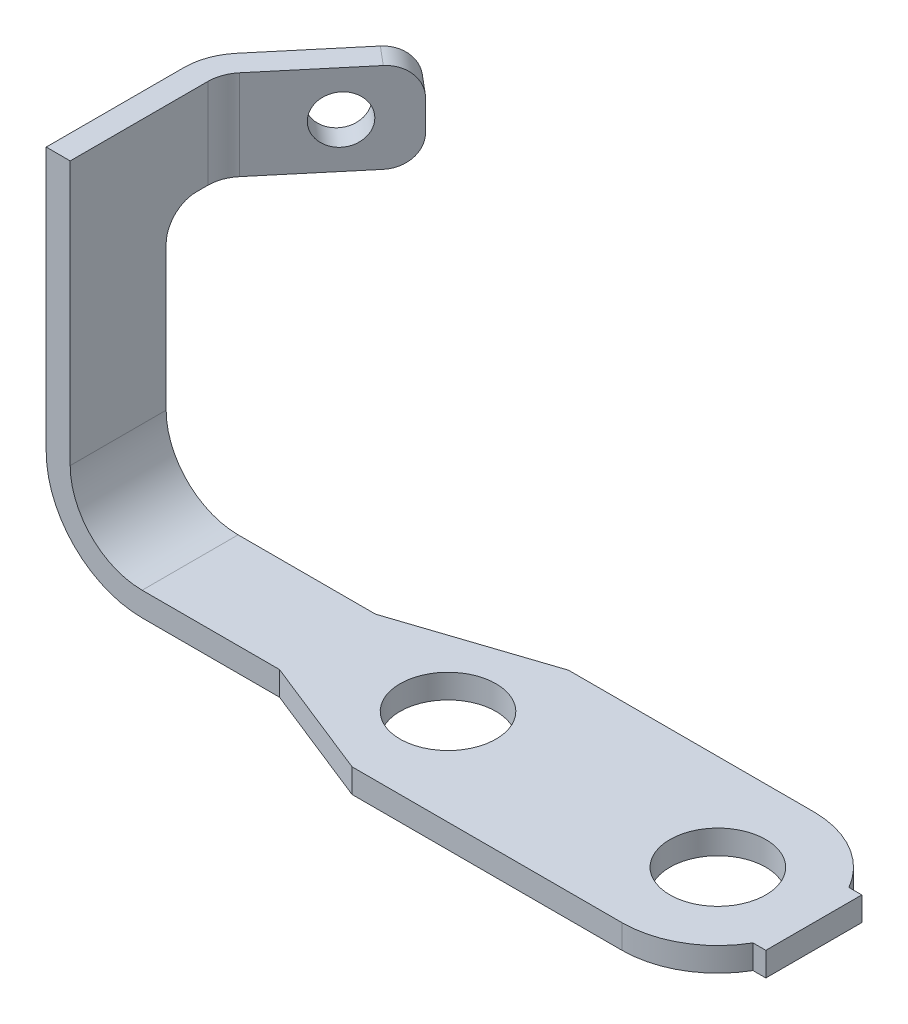
ISO-10303-21;
HEADER;
FILE_DESCRIPTION(('STEP AP214'),'2;1');
FILE_NAME('part.step','',(''),(''),'','','');
FILE_SCHEMA(('AUTOMOTIVE_DESIGN { 1 0 10303 214 1 1 1 1 }'));
ENDSEC;
DATA;
#1=APPLICATION_CONTEXT('core data for automotive mechanical design processes');
#2=APPLICATION_PROTOCOL_DEFINITION('international standard','automotive_design',2000,#1);
#3=PRODUCT_CONTEXT('',#1,'mechanical');
#4=PRODUCT('Part','Part','',(#3));
#5=PRODUCT_RELATED_PRODUCT_CATEGORY('part','',(#4));
#6=PRODUCT_DEFINITION_FORMATION('','',#4);
#7=PRODUCT_DEFINITION_CONTEXT('part definition',#1,'design');
#8=PRODUCT_DEFINITION('design','',#6,#7);
#9=PRODUCT_DEFINITION_SHAPE('','',#8);
#10=(LENGTH_UNIT() NAMED_UNIT(*) SI_UNIT(.MILLI.,.METRE.));
#11=(NAMED_UNIT(*) PLANE_ANGLE_UNIT() SI_UNIT($,.RADIAN.));
#12=(NAMED_UNIT(*) SI_UNIT($,.STERADIAN.) SOLID_ANGLE_UNIT());
#13=UNCERTAINTY_MEASURE_WITH_UNIT(LENGTH_MEASURE(1.E-05),#10,'distance_accuracy_value','');
#14=(GEOMETRIC_REPRESENTATION_CONTEXT(3) GLOBAL_UNCERTAINTY_ASSIGNED_CONTEXT((#13)) GLOBAL_UNIT_ASSIGNED_CONTEXT((#10,
#11,#12)) REPRESENTATION_CONTEXT('',''));
#15=CARTESIAN_POINT('',(0.,0.,0.));
#16=DIRECTION('',(0.,0.,1.));
#17=DIRECTION('',(1.,0.,0.));
#18=AXIS2_PLACEMENT_3D('',#15,#16,#17);
#19=CARTESIAN_POINT('',(-104.,16.,8.));
#20=DIRECTION('',(0.,0.,-1.));
#21=DIRECTION('',(-1.,0.,0.));
#22=AXIS2_PLACEMENT_3D('',#19,#20,#21);
#23=PLANE('',#22);
#24=DIRECTION('',(-1.,0.,0.));
#25=VECTOR('',#24,1.);
#26=CARTESIAN_POINT('',(0.,4.,8.));
#27=LINE('',#26,#25);
#28=CARTESIAN_POINT('',(0.,4.,8.));
#29=VERTEX_POINT('',#28);
#30=CARTESIAN_POINT('',(-2.14359353944898,4.,8.));
#31=VERTEX_POINT('',#30);
#32=EDGE_CURVE('E397',#29,#31,#27,.T.);
#33=ORIENTED_EDGE('',*,*,#32,.T.);
#34=DIRECTION('',(0.,1.,0.));
#35=VECTOR('',#34,1.);
#36=CARTESIAN_POINT('',(-2.14359353944898,0.,8.));
#37=LINE('',#36,#35);
#38=CARTESIAN_POINT('',(-2.14359353944898,0.,8.));
#39=VERTEX_POINT('',#38);
#40=EDGE_CURVE('E345',#39,#31,#37,.T.);
#41=ORIENTED_EDGE('',*,*,#40,.F.);
#42=DIRECTION('',(-1.,0.,0.));
#43=VECTOR('',#42,1.);
#44=CARTESIAN_POINT('',(0.,0.,8.));
#45=LINE('',#44,#43);
#46=CARTESIAN_POINT('',(0.,0.,8.));
#47=VERTEX_POINT('',#46);
#48=EDGE_CURVE('E388',#47,#39,#45,.T.);
#49=ORIENTED_EDGE('',*,*,#48,.F.);
#50=DIRECTION('',(0.,-1.,0.));
#51=VECTOR('',#50,1.);
#52=CARTESIAN_POINT('',(0.,4.,8.));
#53=LINE('',#52,#51);
#54=EDGE_CURVE('E392',#29,#47,#53,.T.);
#55=ORIENTED_EDGE('',*,*,#54,.F.);
#56=EDGE_LOOP('',(#33,#41,#49,#55));
#57=FACE_BOUND('',#56,.T.);
#58=ADVANCED_FACE('F41',(#57),#23,.F.);
#59=CARTESIAN_POINT('',(-104.,16.,-8.));
#60=DIRECTION('',(0.,0.,-1.));
#61=DIRECTION('',(-1.,0.,0.));
#62=AXIS2_PLACEMENT_3D('',#59,#60,#61);
#63=PLANE('',#62);
#64=DIRECTION('',(0.,1.,0.));
#65=VECTOR('',#64,1.);
#66=CARTESIAN_POINT('',(-120.,16.,-8.));
#67=LINE('',#66,#65);
#68=CARTESIAN_POINT('',(-120.,16.,-8.));
#69=VERTEX_POINT('',#68);
#70=CARTESIAN_POINT('',(-120.,40.,-8.));
#71=VERTEX_POINT('',#70);
#72=EDGE_CURVE('E407',#69,#71,#67,.T.);
#73=ORIENTED_EDGE('',*,*,#72,.T.);
#74=DIRECTION('',(-1.,0.,0.));
#75=VECTOR('',#74,1.);
#76=CARTESIAN_POINT('',(-116.,40.,-8.));
#77=LINE('',#76,#75);
#78=CARTESIAN_POINT('',(-116.,40.,-8.));
#79=VERTEX_POINT('',#78);
#80=EDGE_CURVE('E460',#71,#79,#77,.F.);
#81=ORIENTED_EDGE('',*,*,#80,.T.);
#82=DIRECTION('',(0.,1.,0.));
#83=VECTOR('',#82,1.);
#84=CARTESIAN_POINT('',(-116.,16.,-8.));
#85=LINE('',#84,#83);
#86=CARTESIAN_POINT('',(-116.,16.,-8.));
#87=VERTEX_POINT('',#86);
#88=EDGE_CURVE('E349',#87,#79,#85,.T.);
#89=ORIENTED_EDGE('',*,*,#88,.F.);
#90=CARTESIAN_POINT('',(-104.,16.,-8.));
#91=DIRECTION('',(0.,0.,1.));
#92=DIRECTION('',(1.,0.,0.));
#93=AXIS2_PLACEMENT_3D('',#90,#91,#92);
#94=CIRCLE('',#93,12.);
#95=CARTESIAN_POINT('',(-104.,3.99999999999999,-8.));
#96=VERTEX_POINT('',#95);
#97=EDGE_CURVE('E375',#96,#87,#94,.F.);
#98=ORIENTED_EDGE('',*,*,#97,.F.);
#99=DIRECTION('',(-1.,0.,0.));
#100=VECTOR('',#99,1.);
#101=CARTESIAN_POINT('',(0.,4.,-8.));
#102=LINE('',#101,#100);
#103=CARTESIAN_POINT('',(-81.1002883150879,3.99999999999999,-8.));
#104=VERTEX_POINT('',#103);
#105=EDGE_CURVE('E424',#104,#96,#102,.T.);
#106=ORIENTED_EDGE('',*,*,#105,.F.);
#107=DIRECTION('',(0.,1.,0.));
#108=VECTOR('',#107,1.);
#109=CARTESIAN_POINT('',(-81.1002883150879,0.,-8.));
#110=LINE('',#109,#108);
#111=CARTESIAN_POINT('',(-81.1002883150879,0.,-8.));
#112=VERTEX_POINT('',#111);
#113=EDGE_CURVE('E359',#112,#104,#110,.T.);
#114=ORIENTED_EDGE('',*,*,#113,.F.);
#115=DIRECTION('',(-1.,0.,0.));
#116=VECTOR('',#115,1.);
#117=CARTESIAN_POINT('',(0.,0.,-8.));
#118=LINE('',#117,#116);
#119=CARTESIAN_POINT('',(-104.,0.,-8.));
#120=VERTEX_POINT('',#119);
#121=EDGE_CURVE('E415',#112,#120,#118,.T.);
#122=ORIENTED_EDGE('',*,*,#121,.T.);
#123=CARTESIAN_POINT('',(-104.,16.,-8.));
#124=DIRECTION('',(0.,0.,-1.));
#125=DIRECTION('',(-1.,0.,0.));
#126=AXIS2_PLACEMENT_3D('',#123,#124,#125);
#127=CIRCLE('',#126,16.);
#128=EDGE_CURVE('E411',#120,#69,#127,.T.);
#129=ORIENTED_EDGE('',*,*,#128,.T.);
#130=EDGE_LOOP('',(#73,#81,#89,#98,#106,#114,#122,#129));
#131=FACE_BOUND('',#130,.T.);
#132=ADVANCED_FACE('F495',(#131),#63,.T.);
#133=CARTESIAN_POINT('',(-116.,16.,8.));
#134=DIRECTION('',(-1.,0.,0.));
#135=DIRECTION('',(0.,-1.,0.));
#136=AXIS2_PLACEMENT_3D('',#133,#134,#135);
#137=PLANE('',#136);
#138=ORIENTED_EDGE('',*,*,#88,.T.);
#139=CARTESIAN_POINT('',(-116.,40.,-13.));
#140=DIRECTION('',(-1.,0.,0.));
#141=DIRECTION('',(0.,-1.,0.));
#142=AXIS2_PLACEMENT_3D('',#139,#140,#141);
#143=CIRCLE('',#142,5.);
#144=CARTESIAN_POINT('',(-116.,45.,-13.));
#145=VERTEX_POINT('',#144);
#146=EDGE_CURVE('E466',#79,#145,#143,.T.);
#147=ORIENTED_EDGE('',*,*,#146,.T.);
#148=DIRECTION('',(0.,0.,-1.));
#149=VECTOR('',#148,1.);
#150=CARTESIAN_POINT('',(-116.,45.,-8.));
#151=LINE('',#150,#149);
#152=CARTESIAN_POINT('',(-116.,45.,-15.));
#153=VERTEX_POINT('',#152);
#154=EDGE_CURVE('E248',#145,#153,#151,.T.);
#155=ORIENTED_EDGE('',*,*,#154,.T.);
#156=DIRECTION('',(0.,1.,0.));
#157=VECTOR('',#156,1.);
#158=CARTESIAN_POINT('',(-116.,45.,-15.));
#159=LINE('',#158,#157);
#160=CARTESIAN_POINT('',(-116.,60.,-15.));
#161=VERTEX_POINT('',#160);
#162=EDGE_CURVE('E271',#153,#161,#159,.T.);
#163=ORIENTED_EDGE('',*,*,#162,.T.);
#164=DIRECTION('',(0.,0.,-1.));
#165=VECTOR('',#164,1.);
#166=CARTESIAN_POINT('',(-116.,60.,8.));
#167=LINE('',#166,#165);
#168=CARTESIAN_POINT('',(-116.,60.,8.));
#169=VERTEX_POINT('',#168);
#170=EDGE_CURVE('E454',#169,#161,#167,.T.);
#171=ORIENTED_EDGE('',*,*,#170,.F.);
#172=DIRECTION('',(0.,1.,0.));
#173=VECTOR('',#172,1.);
#174=CARTESIAN_POINT('',(-116.,16.,8.));
#175=LINE('',#174,#173);
#176=CARTESIAN_POINT('',(-116.,16.,8.));
#177=VERTEX_POINT('',#176);
#178=EDGE_CURVE('E371',#177,#169,#175,.T.);
#179=ORIENTED_EDGE('',*,*,#178,.F.);
#180=DIRECTION('',(0.,0.,-1.));
#181=VECTOR('',#180,1.);
#182=CARTESIAN_POINT('',(-116.,16.,8.));
#183=LINE('',#182,#181);
#184=EDGE_CURVE('E403',#177,#87,#183,.T.);
#185=ORIENTED_EDGE('',*,*,#184,.T.);
#186=EDGE_LOOP('',(#138,#147,#155,#163,#171,#179,#185));
#187=FACE_BOUND('',#186,.T.);
#188=ADVANCED_FACE('F518',(#187),#137,.F.);
#189=CARTESIAN_POINT('',(-120.,60.,8.));
#190=DIRECTION('',(0.,1.,0.));
#191=DIRECTION('',(0.,0.,1.));
#192=AXIS2_PLACEMENT_3D('',#189,#190,#191);
#193=PLANE('',#192);
#194=DIRECTION('',(0.642787609686544,0.,-0.766044443118974));
#195=VECTOR('',#194,1.);
#196=CARTESIAN_POINT('',(-114.596266658714,60.,-18.8567256581193));
#197=LINE('',#196,#195);
#198=CARTESIAN_POINT('',(-114.596266658714,60.,-18.8567256581193));
#199=VERTEX_POINT('',#198);
#200=CARTESIAN_POINT('',(-103.668877294043,60.,-31.8794811911418));
#201=VERTEX_POINT('',#200);
#202=EDGE_CURVE('E256',#199,#201,#197,.T.);
#203=ORIENTED_EDGE('',*,*,#202,.T.);
#204=DIRECTION('',(0.766044443118975,0.,0.642787609686543));
#205=VECTOR('',#204,1.);
#206=CARTESIAN_POINT('',(-106.733055066519,60.,-34.450631629888));
#207=LINE('',#206,#205);
#208=CARTESIAN_POINT('',(-106.733055066519,60.,-34.450631629888));
#209=VERTEX_POINT('',#208);
#210=EDGE_CURVE('E11',#201,#209,#207,.F.);
#211=ORIENTED_EDGE('',*,*,#210,.T.);
#212=DIRECTION('',(0.642787609686544,0.,-0.766044443118974));
#213=VECTOR('',#212,1.);
#214=CARTESIAN_POINT('',(-117.66044443119,60.,-21.4278760968654));
#215=LINE('',#214,#213);
#216=CARTESIAN_POINT('',(-117.66044443119,60.,-21.4278760968654));
#217=VERTEX_POINT('',#216);
#218=EDGE_CURVE('E259',#217,#209,#215,.T.);
#219=ORIENTED_EDGE('',*,*,#218,.F.);
#220=CARTESIAN_POINT('',(-110.,60.,-15.));
#221=DIRECTION('',(0.,-1.,0.));
#222=DIRECTION('',(0.,0.,-1.));
#223=AXIS2_PLACEMENT_3D('',#220,#221,#222);
#224=CIRCLE('',#223,10.);
#225=CARTESIAN_POINT('',(-120.,60.,-15.));
#226=VERTEX_POINT('',#225);
#227=EDGE_CURVE('E230',#226,#217,#224,.T.);
#228=ORIENTED_EDGE('',*,*,#227,.F.);
#229=DIRECTION('',(0.,0.,-1.));
#230=VECTOR('',#229,1.);
#231=CARTESIAN_POINT('',(-120.,60.,8.));
#232=LINE('',#231,#230);
#233=CARTESIAN_POINT('',(-120.,60.,8.));
#234=VERTEX_POINT('',#233);
#235=EDGE_CURVE('E451',#234,#226,#232,.T.);
#236=ORIENTED_EDGE('',*,*,#235,.F.);
#237=DIRECTION('',(1.,0.,0.));
#238=VECTOR('',#237,1.);
#239=CARTESIAN_POINT('',(-120.,60.,8.));
#240=LINE('',#239,#238);
#241=EDGE_CURVE('E374',#234,#169,#240,.T.);
#242=ORIENTED_EDGE('',*,*,#241,.T.);
#243=ORIENTED_EDGE('',*,*,#170,.T.);
#244=CARTESIAN_POINT('',(-110.,60.,-15.));
#245=DIRECTION('',(0.,1.,0.));
#246=DIRECTION('',(1.,0.,0.));
#247=AXIS2_PLACEMENT_3D('',#244,#245,#246);
#248=CIRCLE('',#247,6.);
#249=EDGE_CURVE('E242',#161,#199,#248,.F.);
#250=ORIENTED_EDGE('',*,*,#249,.T.);
#251=EDGE_LOOP('',(#203,#211,#219,#228,#236,#242,#243,#250));
#252=FACE_BOUND('',#251,.T.);
#253=ADVANCED_FACE('F529',(#252),#193,.T.);
#254=CARTESIAN_POINT('',(-120.,16.,8.));
#255=DIRECTION('',(-1.,0.,0.));
#256=DIRECTION('',(0.,-1.,0.));
#257=AXIS2_PLACEMENT_3D('',#254,#255,#256);
#258=PLANE('',#257);
#259=ORIENTED_EDGE('',*,*,#72,.F.);
#260=DIRECTION('',(0.,0.,-1.));
#261=VECTOR('',#260,1.);
#262=CARTESIAN_POINT('',(-120.,16.,8.));
#263=LINE('',#262,#261);
#264=CARTESIAN_POINT('',(-120.,16.,8.));
#265=VERTEX_POINT('',#264);
#266=EDGE_CURVE('E448',#265,#69,#263,.T.);
#267=ORIENTED_EDGE('',*,*,#266,.F.);
#268=DIRECTION('',(0.,1.,0.));
#269=VECTOR('',#268,1.);
#270=CARTESIAN_POINT('',(-120.,16.,8.));
#271=LINE('',#270,#269);
#272=EDGE_CURVE('E379',#265,#234,#271,.T.);
#273=ORIENTED_EDGE('',*,*,#272,.T.);
#274=ORIENTED_EDGE('',*,*,#235,.T.);
#275=DIRECTION('',(0.,1.,0.));
#276=VECTOR('',#275,1.);
#277=CARTESIAN_POINT('',(-120.,45.,-15.));
#278=LINE('',#277,#276);
#279=CARTESIAN_POINT('',(-120.,45.,-15.));
#280=VERTEX_POINT('',#279);
#281=EDGE_CURVE('E232',#280,#226,#278,.T.);
#282=ORIENTED_EDGE('',*,*,#281,.F.);
#283=DIRECTION('',(0.,0.,-1.));
#284=VECTOR('',#283,1.);
#285=CARTESIAN_POINT('',(-120.,45.,-8.));
#286=LINE('',#285,#284);
#287=CARTESIAN_POINT('',(-120.,45.,-13.));
#288=VERTEX_POINT('',#287);
#289=EDGE_CURVE('E220',#288,#280,#286,.T.);
#290=ORIENTED_EDGE('',*,*,#289,.F.);
#291=CARTESIAN_POINT('',(-120.,40.,-13.));
#292=DIRECTION('',(-1.,0.,0.));
#293=DIRECTION('',(0.,-1.,0.));
#294=AXIS2_PLACEMENT_3D('',#291,#292,#293);
#295=CIRCLE('',#294,5.);
#296=EDGE_CURVE('E463',#288,#71,#295,.F.);
#297=ORIENTED_EDGE('',*,*,#296,.T.);
#298=EDGE_LOOP('',(#259,#267,#273,#274,#282,#290,#297));
#299=FACE_BOUND('',#298,.T.);
#300=ADVANCED_FACE('F509',(#299),#258,.T.);
#301=CARTESIAN_POINT('',(-104.,16.,8.));
#302=DIRECTION('',(0.,0.,-1.));
#303=DIRECTION('',(-1.,0.,0.));
#304=AXIS2_PLACEMENT_3D('',#301,#302,#303);
#305=CYLINDRICAL_SURFACE('',#304,16.);
#306=ORIENTED_EDGE('',*,*,#128,.F.);
#307=DIRECTION('',(0.,0.,-1.));
#308=VECTOR('',#307,1.);
#309=CARTESIAN_POINT('',(-104.,0.,8.));
#310=LINE('',#309,#308);
#311=CARTESIAN_POINT('',(-104.,0.,8.));
#312=VERTEX_POINT('',#311);
#313=EDGE_CURVE('E444',#312,#120,#310,.T.);
#314=ORIENTED_EDGE('',*,*,#313,.F.);
#315=CARTESIAN_POINT('',(-104.,16.,8.));
#316=DIRECTION('',(0.,0.,-1.));
#317=DIRECTION('',(-1.,0.,0.));
#318=AXIS2_PLACEMENT_3D('',#315,#316,#317);
#319=CIRCLE('',#318,16.);
#320=EDGE_CURVE('E383',#312,#265,#319,.T.);
#321=ORIENTED_EDGE('',*,*,#320,.T.);
#322=ORIENTED_EDGE('',*,*,#266,.T.);
#323=EDGE_LOOP('',(#306,#314,#321,#322));
#324=FACE_BOUND('',#323,.T.);
#325=ADVANCED_FACE('F505',(#324),#305,.T.);
#326=CARTESIAN_POINT('',(0.,0.,8.));
#327=DIRECTION('',(0.,-1.,0.));
#328=DIRECTION('',(1.,0.,0.));
#329=AXIS2_PLACEMENT_3D('',#326,#327,#328);
#330=PLANE('',#329);
#331=CARTESIAN_POINT('',(-61.,0.,0.));
#332=DIRECTION('',(0.,1.,0.));
#333=DIRECTION('',(-1.,0.,0.));
#334=AXIS2_PLACEMENT_3D('',#331,#332,#333);
#335=CIRCLE('',#334,8.);
#336=CARTESIAN_POINT('',(-69.,0.,0.));
#337=VERTEX_POINT('',#336);
#338=EDGE_CURVE('E282',#337,#337,#335,.T.);
#339=ORIENTED_EDGE('',*,*,#338,.T.);
#340=EDGE_LOOP('',(#339));
#341=FACE_BOUND('',#340,.T.);
#342=CARTESIAN_POINT('',(-16.,0.,0.));
#343=DIRECTION('',(0.,1.,0.));
#344=DIRECTION('',(-1.,0.,0.));
#345=AXIS2_PLACEMENT_3D('',#342,#343,#344);
#346=CIRCLE('',#345,8.);
#347=CARTESIAN_POINT('',(-24.,0.,0.));
#348=VERTEX_POINT('',#347);
#349=EDGE_CURVE('E291',#348,#348,#346,.T.);
#350=ORIENTED_EDGE('',*,*,#349,.T.);
#351=EDGE_LOOP('',(#350));
#352=FACE_BOUND('',#351,.T.);
#353=DIRECTION('',(0.929114724764402,0.,0.369791601075485));
#354=VECTOR('',#353,1.);
#355=CARTESIAN_POINT('',(-13.8387566682392,0.,34.7703748692441));
#356=LINE('',#355,#354);
#357=CARTESIAN_POINT('',(-81.1002883150879,0.,8.));
#358=VERTEX_POINT('',#357);
#359=CARTESIAN_POINT('',(-61.,0.,16.));
#360=VERTEX_POINT('',#359);
#361=EDGE_CURVE('E310',#358,#360,#356,.T.);
#362=ORIENTED_EDGE('',*,*,#361,.F.);
#363=EDGE_CURVE('E387',#358,#312,#45,.T.);
#364=ORIENTED_EDGE('',*,*,#363,.T.);
#365=ORIENTED_EDGE('',*,*,#313,.T.);
#366=ORIENTED_EDGE('',*,*,#121,.F.);
#367=DIRECTION('',(-0.949440631263259,0.,0.313946631939926));
#368=VECTOR('',#367,1.);
#369=CARTESIAN_POINT('',(-10.3780356773394,0.,-31.3853621677049));
#370=LINE('',#369,#368);
#371=CARTESIAN_POINT('',(-56.9066060858118,0.,-16.));
#372=VERTEX_POINT('',#371);
#373=EDGE_CURVE('E307',#372,#112,#370,.T.);
#374=ORIENTED_EDGE('',*,*,#373,.F.);
#375=DIRECTION('',(-1.,0.,0.));
#376=VECTOR('',#375,1.);
#377=CARTESIAN_POINT('',(0.,0.,-16.));
#378=LINE('',#377,#376);
#379=CARTESIAN_POINT('',(-16.,0.,-16.));
#380=VERTEX_POINT('',#379);
#381=EDGE_CURVE('E302',#380,#372,#378,.T.);
#382=ORIENTED_EDGE('',*,*,#381,.F.);
#383=CARTESIAN_POINT('',(-16.,0.,0.));
#384=DIRECTION('',(0.,1.,0.));
#385=DIRECTION('',(-1.,0.,0.));
#386=AXIS2_PLACEMENT_3D('',#383,#384,#385);
#387=CIRCLE('',#386,16.);
#388=CARTESIAN_POINT('',(-2.14359353944898,0.,-8.));
#389=VERTEX_POINT('',#388);
#390=EDGE_CURVE('E298',#389,#380,#387,.T.);
#391=ORIENTED_EDGE('',*,*,#390,.F.);
#392=CARTESIAN_POINT('',(0.,0.,-8.));
#393=VERTEX_POINT('',#392);
#394=EDGE_CURVE('E416',#393,#389,#118,.T.);
#395=ORIENTED_EDGE('',*,*,#394,.F.);
#396=DIRECTION('',(0.,0.,-1.));
#397=VECTOR('',#396,1.);
#398=CARTESIAN_POINT('',(0.,0.,8.));
#399=LINE('',#398,#397);
#400=EDGE_CURVE('E441',#47,#393,#399,.T.);
#401=ORIENTED_EDGE('',*,*,#400,.F.);
#402=ORIENTED_EDGE('',*,*,#48,.T.);
#403=CARTESIAN_POINT('',(-16.,0.,0.));
#404=DIRECTION('',(0.,1.,0.));
#405=DIRECTION('',(-1.,0.,0.));
#406=AXIS2_PLACEMENT_3D('',#403,#404,#405);
#407=CIRCLE('',#406,16.);
#408=CARTESIAN_POINT('',(-16.,0.,16.));
#409=VERTEX_POINT('',#408);
#410=EDGE_CURVE('E318',#409,#39,#407,.T.);
#411=ORIENTED_EDGE('',*,*,#410,.F.);
#412=DIRECTION('',(1.,0.,0.));
#413=VECTOR('',#412,1.);
#414=CARTESIAN_POINT('',(0.,0.,16.));
#415=LINE('',#414,#413);
#416=EDGE_CURVE('E314',#360,#409,#415,.T.);
#417=ORIENTED_EDGE('',*,*,#416,.F.);
#418=EDGE_LOOP('',(#362,#364,#365,#366,#374,#382,#391,#395,#401,#402,#411,#417));
#419=FACE_BOUND('',#418,.T.);
#420=ADVANCED_FACE('F502',(#341,#352,#419),#330,.T.);
#421=CARTESIAN_POINT('',(0.,4.,8.));
#422=DIRECTION('',(1.,0.,0.));
#423=DIRECTION('',(0.,1.,0.));
#424=AXIS2_PLACEMENT_3D('',#421,#422,#423);
#425=PLANE('',#424);
#426=DIRECTION('',(0.,-1.,0.));
#427=VECTOR('',#426,1.);
#428=CARTESIAN_POINT('',(0.,4.,-8.));
#429=LINE('',#428,#427);
#430=CARTESIAN_POINT('',(0.,4.,-8.));
#431=VERTEX_POINT('',#430);
#432=EDGE_CURVE('E420',#431,#393,#429,.T.);
#433=ORIENTED_EDGE('',*,*,#432,.F.);
#434=DIRECTION('',(0.,0.,-1.));
#435=VECTOR('',#434,1.);
#436=CARTESIAN_POINT('',(0.,4.,8.));
#437=LINE('',#436,#435);
#438=EDGE_CURVE('E438',#29,#431,#437,.T.);
#439=ORIENTED_EDGE('',*,*,#438,.F.);
#440=ORIENTED_EDGE('',*,*,#54,.T.);
#441=ORIENTED_EDGE('',*,*,#400,.T.);
#442=EDGE_LOOP('',(#433,#439,#440,#441));
#443=FACE_BOUND('',#442,.T.);
#444=ADVANCED_FACE('F572',(#443),#425,.T.);
#445=CARTESIAN_POINT('',(0.,4.,8.));
#446=DIRECTION('',(0.,-1.,0.));
#447=DIRECTION('',(1.,0.,0.));
#448=AXIS2_PLACEMENT_3D('',#445,#446,#447);
#449=PLANE('',#448);
#450=CARTESIAN_POINT('',(-61.,3.99999999999999,0.));
#451=DIRECTION('',(0.,1.,0.));
#452=DIRECTION('',(-1.,0.,0.));
#453=AXIS2_PLACEMENT_3D('',#450,#451,#452);
#454=CIRCLE('',#453,8.);
#455=CARTESIAN_POINT('',(-69.,3.99999999999999,0.));
#456=VERTEX_POINT('',#455);
#457=EDGE_CURVE('E287',#456,#456,#454,.T.);
#458=ORIENTED_EDGE('',*,*,#457,.F.);
#459=EDGE_LOOP('',(#458));
#460=FACE_BOUND('',#459,.T.);
#461=CARTESIAN_POINT('',(-16.,4.,0.));
#462=DIRECTION('',(0.,1.,0.));
#463=DIRECTION('',(-1.,0.,0.));
#464=AXIS2_PLACEMENT_3D('',#461,#462,#463);
#465=CIRCLE('',#464,8.);
#466=CARTESIAN_POINT('',(-24.,4.,0.));
#467=VERTEX_POINT('',#466);
#468=EDGE_CURVE('E270',#467,#467,#465,.T.);
#469=ORIENTED_EDGE('',*,*,#468,.F.);
#470=EDGE_LOOP('',(#469));
#471=FACE_BOUND('',#470,.T.);
#472=CARTESIAN_POINT('',(-81.1002883150879,3.99999999999999,8.));
#473=VERTEX_POINT('',#472);
#474=CARTESIAN_POINT('',(-104.,3.99999999999999,8.));
#475=VERTEX_POINT('',#474);
#476=EDGE_CURVE('E396',#473,#475,#27,.T.);
#477=ORIENTED_EDGE('',*,*,#476,.F.);
#478=DIRECTION('',(0.929114724764402,0.,0.369791601075485));
#479=VECTOR('',#478,1.);
#480=CARTESIAN_POINT('',(-13.8387566682392,4.,34.7703748692441));
#481=LINE('',#480,#479);
#482=CARTESIAN_POINT('',(-61.,3.99999999999999,16.));
#483=VERTEX_POINT('',#482);
#484=EDGE_CURVE('E334',#473,#483,#481,.T.);
#485=ORIENTED_EDGE('',*,*,#484,.T.);
#486=DIRECTION('',(1.,0.,0.));
#487=VECTOR('',#486,1.);
#488=CARTESIAN_POINT('',(0.,4.,16.));
#489=LINE('',#488,#487);
#490=CARTESIAN_POINT('',(-16.,4.,16.));
#491=VERTEX_POINT('',#490);
#492=EDGE_CURVE('E338',#483,#491,#489,.T.);
#493=ORIENTED_EDGE('',*,*,#492,.T.);
#494=CARTESIAN_POINT('',(-16.,4.,0.));
#495=DIRECTION('',(0.,1.,0.));
#496=DIRECTION('',(-1.,0.,0.));
#497=AXIS2_PLACEMENT_3D('',#494,#495,#496);
#498=CIRCLE('',#497,16.);
#499=EDGE_CURVE('E303',#491,#31,#498,.T.);
#500=ORIENTED_EDGE('',*,*,#499,.T.);
#501=ORIENTED_EDGE('',*,*,#32,.F.);
#502=ORIENTED_EDGE('',*,*,#438,.T.);
#503=CARTESIAN_POINT('',(-2.14359353944898,4.,-8.));
#504=VERTEX_POINT('',#503);
#505=EDGE_CURVE('E425',#431,#504,#102,.T.);
#506=ORIENTED_EDGE('',*,*,#505,.T.);
#507=CARTESIAN_POINT('',(-16.,4.,0.));
#508=DIRECTION('',(0.,1.,0.));
#509=DIRECTION('',(-1.,0.,0.));
#510=AXIS2_PLACEMENT_3D('',#507,#508,#509);
#511=CIRCLE('',#510,16.);
#512=CARTESIAN_POINT('',(-16.,4.,-16.));
#513=VERTEX_POINT('',#512);
#514=EDGE_CURVE('E286',#504,#513,#511,.T.);
#515=ORIENTED_EDGE('',*,*,#514,.T.);
#516=DIRECTION('',(-1.,0.,0.));
#517=VECTOR('',#516,1.);
#518=CARTESIAN_POINT('',(0.,4.,-16.));
#519=LINE('',#518,#517);
#520=CARTESIAN_POINT('',(-56.9066060858118,3.99999999999999,-16.));
#521=VERTEX_POINT('',#520);
#522=EDGE_CURVE('E326',#513,#521,#519,.T.);
#523=ORIENTED_EDGE('',*,*,#522,.T.);
#524=DIRECTION('',(-0.949440631263259,0.,0.313946631939926));
#525=VECTOR('',#524,1.);
#526=CARTESIAN_POINT('',(-10.3780356773394,4.,-31.3853621677049));
#527=LINE('',#526,#525);
#528=EDGE_CURVE('E330',#521,#104,#527,.T.);
#529=ORIENTED_EDGE('',*,*,#528,.T.);
#530=ORIENTED_EDGE('',*,*,#105,.T.);
#531=DIRECTION('',(0.,0.,-1.));
#532=VECTOR('',#531,1.);
#533=CARTESIAN_POINT('',(-104.,3.99999999999999,8.));
#534=LINE('',#533,#532);
#535=EDGE_CURVE('E434',#475,#96,#534,.T.);
#536=ORIENTED_EDGE('',*,*,#535,.F.);
#537=EDGE_LOOP('',(#477,#485,#493,#500,#501,#502,#506,#515,#523,#529,#530,#536));
#538=FACE_BOUND('',#537,.T.);
#539=ADVANCED_FACE('F566',(#460,#471,#538),#449,.F.);
#540=CARTESIAN_POINT('',(-104.,16.,8.));
#541=DIRECTION('',(0.,0.,-1.));
#542=DIRECTION('',(-1.,0.,0.));
#543=AXIS2_PLACEMENT_3D('',#540,#541,#542);
#544=CYLINDRICAL_SURFACE('',#543,12.);
#545=ORIENTED_EDGE('',*,*,#97,.T.);
#546=ORIENTED_EDGE('',*,*,#184,.F.);
#547=CARTESIAN_POINT('',(-104.,16.,8.));
#548=DIRECTION('',(0.,0.,1.));
#549=DIRECTION('',(1.,0.,0.));
#550=AXIS2_PLACEMENT_3D('',#547,#548,#549);
#551=CIRCLE('',#550,12.);
#552=EDGE_CURVE('E400',#475,#177,#551,.F.);
#553=ORIENTED_EDGE('',*,*,#552,.F.);
#554=ORIENTED_EDGE('',*,*,#535,.T.);
#555=EDGE_LOOP('',(#545,#546,#553,#554));
#556=FACE_BOUND('',#555,.T.);
#557=ADVANCED_FACE('F559',(#556),#544,.F.);
#558=ORIENTED_EDGE('',*,*,#363,.F.);
#559=DIRECTION('',(0.,1.,0.));
#560=VECTOR('',#559,1.);
#561=CARTESIAN_POINT('',(-81.1002883150879,0.,8.));
#562=LINE('',#561,#560);
#563=EDGE_CURVE('E356',#358,#473,#562,.T.);
#564=ORIENTED_EDGE('',*,*,#563,.T.);
#565=ORIENTED_EDGE('',*,*,#476,.T.);
#566=ORIENTED_EDGE('',*,*,#552,.T.);
#567=ORIENTED_EDGE('',*,*,#178,.T.);
#568=ORIENTED_EDGE('',*,*,#241,.F.);
#569=ORIENTED_EDGE('',*,*,#272,.F.);
#570=ORIENTED_EDGE('',*,*,#320,.F.);
#571=EDGE_LOOP('',(#558,#564,#565,#566,#567,#568,#569,#570));
#572=FACE_BOUND('',#571,.T.);
#573=ADVANCED_FACE('F531',(#572),#23,.F.);
#574=DIRECTION('',(0.,1.,0.));
#575=VECTOR('',#574,1.);
#576=CARTESIAN_POINT('',(-2.14359353944898,0.,-8.));
#577=LINE('',#576,#575);
#578=EDGE_CURVE('E322',#389,#504,#577,.T.);
#579=ORIENTED_EDGE('',*,*,#578,.T.);
#580=ORIENTED_EDGE('',*,*,#505,.F.);
#581=ORIENTED_EDGE('',*,*,#432,.T.);
#582=ORIENTED_EDGE('',*,*,#394,.T.);
#583=EDGE_LOOP('',(#579,#580,#581,#582));
#584=FACE_BOUND('',#583,.T.);
#585=ADVANCED_FACE('F556',(#584),#63,.T.);
#586=CARTESIAN_POINT('',(0.,0.,-16.));
#587=DIRECTION('',(0.,0.,-1.));
#588=DIRECTION('',(-1.,0.,0.));
#589=AXIS2_PLACEMENT_3D('',#586,#587,#588);
#590=PLANE('',#589);
#591=ORIENTED_EDGE('',*,*,#522,.F.);
#592=DIRECTION('',(0.,1.,0.));
#593=VECTOR('',#592,1.);
#594=CARTESIAN_POINT('',(-16.,0.,-16.));
#595=LINE('',#594,#593);
#596=EDGE_CURVE('E365',#380,#513,#595,.T.);
#597=ORIENTED_EDGE('',*,*,#596,.F.);
#598=ORIENTED_EDGE('',*,*,#381,.T.);
#599=DIRECTION('',(0.,1.,0.));
#600=VECTOR('',#599,1.);
#601=CARTESIAN_POINT('',(-56.9066060858118,0.,-16.));
#602=LINE('',#601,#600);
#603=EDGE_CURVE('E362',#372,#521,#602,.T.);
#604=ORIENTED_EDGE('',*,*,#603,.T.);
#605=EDGE_LOOP('',(#591,#597,#598,#604));
#606=FACE_BOUND('',#605,.T.);
#607=ADVANCED_FACE('F564',(#606),#590,.T.);
#608=CARTESIAN_POINT('',(-16.,0.,0.));
#609=DIRECTION('',(0.,1.,0.));
#610=DIRECTION('',(-1.,0.,0.));
#611=AXIS2_PLACEMENT_3D('',#608,#609,#610);
#612=CYLINDRICAL_SURFACE('',#611,16.);
#613=ORIENTED_EDGE('',*,*,#514,.F.);
#614=ORIENTED_EDGE('',*,*,#578,.F.);
#615=ORIENTED_EDGE('',*,*,#390,.T.);
#616=ORIENTED_EDGE('',*,*,#596,.T.);
#617=EDGE_LOOP('',(#613,#614,#615,#616));
#618=FACE_BOUND('',#617,.T.);
#619=ADVANCED_FACE('F728',(#618),#612,.T.);
#620=CARTESIAN_POINT('',(-10.3780356773394,0.,-31.3853621677049));
#621=DIRECTION('',(-0.313946631939926,0.,-0.949440631263259));
#622=DIRECTION('',(-0.949440631263259,0.,0.313946631939926));
#623=AXIS2_PLACEMENT_3D('',#620,#621,#622);
#624=PLANE('',#623);
#625=ORIENTED_EDGE('',*,*,#528,.F.);
#626=ORIENTED_EDGE('',*,*,#603,.F.);
#627=ORIENTED_EDGE('',*,*,#373,.T.);
#628=ORIENTED_EDGE('',*,*,#113,.T.);
#629=EDGE_LOOP('',(#625,#626,#627,#628));
#630=FACE_BOUND('',#629,.T.);
#631=ADVANCED_FACE('F738',(#630),#624,.T.);
#632=CARTESIAN_POINT('',(-16.,0.,0.));
#633=DIRECTION('',(0.,1.,0.));
#634=DIRECTION('',(-1.,0.,0.));
#635=AXIS2_PLACEMENT_3D('',#632,#633,#634);
#636=CYLINDRICAL_SURFACE('',#635,16.);
#637=ORIENTED_EDGE('',*,*,#499,.F.);
#638=DIRECTION('',(0.,1.,0.));
#639=VECTOR('',#638,1.);
#640=CARTESIAN_POINT('',(-16.,0.,16.));
#641=LINE('',#640,#639);
#642=EDGE_CURVE('E350',#409,#491,#641,.T.);
#643=ORIENTED_EDGE('',*,*,#642,.F.);
#644=ORIENTED_EDGE('',*,*,#410,.T.);
#645=ORIENTED_EDGE('',*,*,#40,.T.);
#646=EDGE_LOOP('',(#637,#643,#644,#645));
#647=FACE_BOUND('',#646,.T.);
#648=ADVANCED_FACE('F747',(#647),#636,.T.);
#649=CARTESIAN_POINT('',(0.,0.,16.));
#650=DIRECTION('',(0.,0.,1.));
#651=DIRECTION('',(1.,0.,0.));
#652=AXIS2_PLACEMENT_3D('',#649,#650,#651);
#653=PLANE('',#652);
#654=ORIENTED_EDGE('',*,*,#492,.F.);
#655=DIRECTION('',(0.,1.,0.));
#656=VECTOR('',#655,1.);
#657=CARTESIAN_POINT('',(-61.,0.,16.));
#658=LINE('',#657,#656);
#659=EDGE_CURVE('E353',#360,#483,#658,.T.);
#660=ORIENTED_EDGE('',*,*,#659,.F.);
#661=ORIENTED_EDGE('',*,*,#416,.T.);
#662=ORIENTED_EDGE('',*,*,#642,.T.);
#663=EDGE_LOOP('',(#654,#660,#661,#662));
#664=FACE_BOUND('',#663,.T.);
#665=ADVANCED_FACE('F757',(#664),#653,.T.);
#666=CARTESIAN_POINT('',(-13.8387566682392,0.,34.7703748692441));
#667=DIRECTION('',(-0.369791601075485,0.,0.929114724764402));
#668=DIRECTION('',(0.929114724764402,0.,0.369791601075485));
#669=AXIS2_PLACEMENT_3D('',#666,#667,#668);
#670=PLANE('',#669);
#671=ORIENTED_EDGE('',*,*,#484,.F.);
#672=ORIENTED_EDGE('',*,*,#563,.F.);
#673=ORIENTED_EDGE('',*,*,#361,.T.);
#674=ORIENTED_EDGE('',*,*,#659,.T.);
#675=EDGE_LOOP('',(#671,#672,#673,#674));
#676=FACE_BOUND('',#675,.T.);
#677=ADVANCED_FACE('F633',(#676),#670,.T.);
#678=CARTESIAN_POINT('',(-16.,0.,0.));
#679=DIRECTION('',(0.,1.,0.));
#680=DIRECTION('',(-1.,0.,0.));
#681=AXIS2_PLACEMENT_3D('',#678,#679,#680);
#682=CYLINDRICAL_SURFACE('',#681,8.);
#683=ORIENTED_EDGE('',*,*,#349,.F.);
#684=EDGE_LOOP('',(#683));
#685=FACE_BOUND('',#684,.T.);
#686=ORIENTED_EDGE('',*,*,#468,.T.);
#687=EDGE_LOOP('',(#686));
#688=FACE_BOUND('',#687,.T.);
#689=ADVANCED_FACE('F627',(#685,#688),#682,.F.);
#690=CARTESIAN_POINT('',(-61.,0.,0.));
#691=DIRECTION('',(0.,1.,0.));
#692=DIRECTION('',(-1.,0.,0.));
#693=AXIS2_PLACEMENT_3D('',#690,#691,#692);
#694=CYLINDRICAL_SURFACE('',#693,8.);
#695=ORIENTED_EDGE('',*,*,#338,.F.);
#696=EDGE_LOOP('',(#695));
#697=FACE_BOUND('',#696,.T.);
#698=ORIENTED_EDGE('',*,*,#457,.T.);
#699=EDGE_LOOP('',(#698));
#700=FACE_BOUND('',#699,.T.);
#701=ADVANCED_FACE('F632',(#697,#700),#694,.F.);
#702=CARTESIAN_POINT('',(-114.596266658714,45.,-18.8567256581193));
#703=DIRECTION('',(0.766044443118974,0.,0.642787609686543));
#704=DIRECTION('',(0.642787609686544,0.,-0.766044443118975));
#705=AXIS2_PLACEMENT_3D('',#702,#703,#704);
#706=PLANE('',#705);
#707=CARTESIAN_POINT('',(-106.882815342475,52.5,-28.049258975547));
#708=DIRECTION('',(0.766044443118975,0.,0.642787609686544));
#709=DIRECTION('',(0.642787609686544,0.,-0.766044443118975));
#710=AXIS2_PLACEMENT_3D('',#707,#708,#709);
#711=CIRCLE('',#710,4.);
#712=CARTESIAN_POINT('',(-104.311664903729,52.5,-31.1134367480229));
#713=VERTEX_POINT('',#712);
#714=EDGE_CURVE('E794',#713,#713,#711,.T.);
#715=ORIENTED_EDGE('',*,*,#714,.F.);
#716=EDGE_LOOP('',(#715));
#717=FACE_BOUND('',#716,.T.);
#718=DIRECTION('',(0.642787609686544,0.,-0.766044443118974));
#719=VECTOR('',#718,1.);
#720=CARTESIAN_POINT('',(-114.596266658714,45.,-18.8567256581193));
#721=LINE('',#720,#719);
#722=CARTESIAN_POINT('',(-114.596266658714,45.,-18.8567256581193));
#723=VERTEX_POINT('',#722);
#724=CARTESIAN_POINT('',(-103.668877294043,45.,-31.8794811911418));
#725=VERTEX_POINT('',#724);
#726=EDGE_CURVE('E238',#723,#725,#721,.T.);
#727=ORIENTED_EDGE('',*,*,#726,.T.);
#728=CARTESIAN_POINT('',(-103.668877294043,50.,-31.8794811911418));
#729=DIRECTION('',(0.766044443118974,0.,0.642787609686543));
#730=DIRECTION('',(0.642787609686544,0.,-0.766044443118975));
#731=AXIS2_PLACEMENT_3D('',#728,#729,#730);
#732=CIRCLE('',#731,5.);
#733=CARTESIAN_POINT('',(-100.45493924561,50.,-35.7097034067367));
#734=VERTEX_POINT('',#733);
#735=EDGE_CURVE('E475',#725,#734,#732,.T.);
#736=ORIENTED_EDGE('',*,*,#735,.T.);
#737=DIRECTION('',(0.,1.,0.));
#738=VECTOR('',#737,1.);
#739=CARTESIAN_POINT('',(-100.45493924561,45.,-35.7097034067367));
#740=LINE('',#739,#738);
#741=CARTESIAN_POINT('',(-100.45493924561,55.,-35.7097034067367));
#742=VERTEX_POINT('',#741);
#743=EDGE_CURVE('E255',#734,#742,#740,.T.);
#744=ORIENTED_EDGE('',*,*,#743,.T.);
#745=CARTESIAN_POINT('',(-103.668877294043,55.,-31.8794811911418));
#746=DIRECTION('',(0.766044443118974,0.,0.642787609686543));
#747=DIRECTION('',(0.642787609686544,0.,-0.766044443118975));
#748=AXIS2_PLACEMENT_3D('',#745,#746,#747);
#749=CIRCLE('',#748,5.);
#750=EDGE_CURVE('E472',#742,#201,#749,.T.);
#751=ORIENTED_EDGE('',*,*,#750,.T.);
#752=ORIENTED_EDGE('',*,*,#202,.F.);
#753=DIRECTION('',(0.,1.,0.));
#754=VECTOR('',#753,1.);
#755=CARTESIAN_POINT('',(-114.596266658714,45.,-18.8567256581193));
#756=LINE('',#755,#754);
#757=EDGE_CURVE('E267',#723,#199,#756,.T.);
#758=ORIENTED_EDGE('',*,*,#757,.F.);
#759=EDGE_LOOP('',(#727,#736,#744,#751,#752,#758));
#760=FACE_BOUND('',#759,.T.);
#761=ADVANCED_FACE('F539',(#717,#760),#706,.T.);
#762=CARTESIAN_POINT('',(-110.,45.,-15.));
#763=DIRECTION('',(0.,1.,0.));
#764=DIRECTION('',(0.,0.,1.));
#765=AXIS2_PLACEMENT_3D('',#762,#763,#764);
#766=CYLINDRICAL_SURFACE('',#765,6.);
#767=ORIENTED_EDGE('',*,*,#249,.F.);
#768=ORIENTED_EDGE('',*,*,#162,.F.);
#769=CARTESIAN_POINT('',(-110.,45.,-15.));
#770=DIRECTION('',(0.,1.,0.));
#771=DIRECTION('',(1.,0.,0.));
#772=AXIS2_PLACEMENT_3D('',#769,#770,#771);
#773=CIRCLE('',#772,6.);
#774=EDGE_CURVE('E251',#153,#723,#773,.F.);
#775=ORIENTED_EDGE('',*,*,#774,.T.);
#776=ORIENTED_EDGE('',*,*,#757,.T.);
#777=EDGE_LOOP('',(#767,#768,#775,#776));
#778=FACE_BOUND('',#777,.T.);
#779=ADVANCED_FACE('F524',(#778),#766,.F.);
#780=CARTESIAN_POINT('',(-110.,45.,-15.));
#781=DIRECTION('',(0.,1.,0.));
#782=DIRECTION('',(0.,0.,1.));
#783=AXIS2_PLACEMENT_3D('',#780,#781,#782);
#784=CYLINDRICAL_SURFACE('',#783,10.);
#785=ORIENTED_EDGE('',*,*,#227,.T.);
#786=DIRECTION('',(0.,1.,0.));
#787=VECTOR('',#786,1.);
#788=CARTESIAN_POINT('',(-117.66044443119,45.,-21.4278760968654));
#789=LINE('',#788,#787);
#790=CARTESIAN_POINT('',(-117.66044443119,45.,-21.4278760968654));
#791=VERTEX_POINT('',#790);
#792=EDGE_CURVE('E227',#791,#217,#789,.T.);
#793=ORIENTED_EDGE('',*,*,#792,.F.);
#794=CARTESIAN_POINT('',(-110.,45.,-15.));
#795=DIRECTION('',(0.,-1.,0.));
#796=DIRECTION('',(0.,0.,-1.));
#797=AXIS2_PLACEMENT_3D('',#794,#795,#796);
#798=CIRCLE('',#797,10.);
#799=EDGE_CURVE('E211',#280,#791,#798,.T.);
#800=ORIENTED_EDGE('',*,*,#799,.F.);
#801=ORIENTED_EDGE('',*,*,#281,.T.);
#802=EDGE_LOOP('',(#785,#793,#800,#801));
#803=FACE_BOUND('',#802,.T.);
#804=ADVANCED_FACE('F228',(#803),#784,.T.);
#805=CARTESIAN_POINT('',(-117.66044443119,45.,-21.4278760968654));
#806=DIRECTION('',(0.766044443118974,0.,0.642787609686543));
#807=DIRECTION('',(0.642787609686544,0.,-0.766044443118975));
#808=AXIS2_PLACEMENT_3D('',#805,#806,#807);
#809=PLANE('',#808);
#810=CARTESIAN_POINT('',(-109.946993114951,52.5,-30.6204094142931));
#811=DIRECTION('',(0.766044443118974,0.,0.642787609686543));
#812=DIRECTION('',(0.642787609686544,0.,-0.766044443118975));
#813=AXIS2_PLACEMENT_3D('',#810,#811,#812);
#814=CIRCLE('',#813,4.);
#815=CARTESIAN_POINT('',(-107.375842676205,52.5,-33.684587186769));
#816=VERTEX_POINT('',#815);
#817=EDGE_CURVE('E45',#816,#816,#814,.T.);
#818=ORIENTED_EDGE('',*,*,#817,.T.);
#819=EDGE_LOOP('',(#818));
#820=FACE_BOUND('',#819,.T.);
#821=DIRECTION('',(0.,1.,0.));
#822=VECTOR('',#821,1.);
#823=CARTESIAN_POINT('',(-103.519117018086,45.,-38.2808538454829));
#824=LINE('',#823,#822);
#825=CARTESIAN_POINT('',(-103.519117018086,50.,-38.2808538454829));
#826=VERTEX_POINT('',#825);
#827=CARTESIAN_POINT('',(-103.519117018086,55.,-38.2808538454829));
#828=VERTEX_POINT('',#827);
#829=EDGE_CURVE('E233',#826,#828,#824,.T.);
#830=ORIENTED_EDGE('',*,*,#829,.F.);
#831=CARTESIAN_POINT('',(-106.733055066519,50.,-34.450631629888));
#832=DIRECTION('',(0.766044443118974,0.,0.642787609686543));
#833=DIRECTION('',(0.642787609686544,0.,-0.766044443118975));
#834=AXIS2_PLACEMENT_3D('',#831,#832,#833);
#835=CIRCLE('',#834,5.);
#836=CARTESIAN_POINT('',(-106.733055066519,45.,-34.450631629888));
#837=VERTEX_POINT('',#836);
#838=EDGE_CURVE('E51',#826,#837,#835,.F.);
#839=ORIENTED_EDGE('',*,*,#838,.T.);
#840=DIRECTION('',(0.642787609686544,0.,-0.766044443118974));
#841=VECTOR('',#840,1.);
#842=CARTESIAN_POINT('',(-117.66044443119,45.,-21.4278760968654));
#843=LINE('',#842,#841);
#844=EDGE_CURVE('E216',#791,#837,#843,.T.);
#845=ORIENTED_EDGE('',*,*,#844,.F.);
#846=ORIENTED_EDGE('',*,*,#792,.T.);
#847=ORIENTED_EDGE('',*,*,#218,.T.);
#848=CARTESIAN_POINT('',(-106.733055066519,55.,-34.450631629888));
#849=DIRECTION('',(0.766044443118974,0.,0.642787609686543));
#850=DIRECTION('',(0.642787609686544,0.,-0.766044443118975));
#851=AXIS2_PLACEMENT_3D('',#848,#849,#850);
#852=CIRCLE('',#851,5.);
#853=EDGE_CURVE('E63',#209,#828,#852,.F.);
#854=ORIENTED_EDGE('',*,*,#853,.T.);
#855=EDGE_LOOP('',(#830,#839,#845,#846,#847,#854));
#856=FACE_BOUND('',#855,.T.);
#857=ADVANCED_FACE('F235',(#820,#856),#809,.F.);
#858=CARTESIAN_POINT('',(-103.519117018086,45.,-38.2808538454829));
#859=DIRECTION('',(-0.642787609686543,0.,0.766044443118975));
#860=DIRECTION('',(0.766044443118975,0.,0.642787609686543));
#861=AXIS2_PLACEMENT_3D('',#858,#859,#860);
#862=PLANE('',#861);
#863=ORIENTED_EDGE('',*,*,#743,.F.);
#864=DIRECTION('',(0.766044443118975,0.,0.642787609686543));
#865=VECTOR('',#864,1.);
#866=CARTESIAN_POINT('',(-103.519117018086,50.,-38.2808538454829));
#867=LINE('',#866,#865);
#868=EDGE_CURVE('E482',#734,#826,#867,.F.);
#869=ORIENTED_EDGE('',*,*,#868,.T.);
#870=ORIENTED_EDGE('',*,*,#829,.T.);
#871=DIRECTION('',(0.766044443118975,0.,0.642787609686543));
#872=VECTOR('',#871,1.);
#873=CARTESIAN_POINT('',(-100.45493924561,55.,-35.7097034067367));
#874=LINE('',#873,#872);
#875=EDGE_CURVE('E478',#828,#742,#874,.T.);
#876=ORIENTED_EDGE('',*,*,#875,.T.);
#877=EDGE_LOOP('',(#863,#869,#870,#876));
#878=FACE_BOUND('',#877,.T.);
#879=ADVANCED_FACE('F536',(#878),#862,.F.);
#880=CARTESIAN_POINT('',(-110.,45.,-15.));
#881=DIRECTION('',(0.,-1.,0.));
#882=DIRECTION('',(-1.,0.,0.));
#883=AXIS2_PLACEMENT_3D('',#880,#881,#882);
#884=PLANE('',#883);
#885=ORIENTED_EDGE('',*,*,#844,.T.);
#886=DIRECTION('',(0.766044443118975,0.,0.642787609686543));
#887=VECTOR('',#886,1.);
#888=CARTESIAN_POINT('',(-103.668877294043,45.,-31.8794811911418));
#889=LINE('',#888,#887);
#890=EDGE_CURVE('E469',#837,#725,#889,.T.);
#891=ORIENTED_EDGE('',*,*,#890,.T.);
#892=ORIENTED_EDGE('',*,*,#726,.F.);
#893=ORIENTED_EDGE('',*,*,#774,.F.);
#894=ORIENTED_EDGE('',*,*,#154,.F.);
#895=DIRECTION('',(-1.,0.,0.));
#896=VECTOR('',#895,1.);
#897=CARTESIAN_POINT('',(-120.,45.,-13.));
#898=LINE('',#897,#896);
#899=EDGE_CURVE('E457',#145,#288,#898,.T.);
#900=ORIENTED_EDGE('',*,*,#899,.T.);
#901=ORIENTED_EDGE('',*,*,#289,.T.);
#902=ORIENTED_EDGE('',*,*,#799,.T.);
#903=EDGE_LOOP('',(#885,#891,#892,#893,#894,#900,#901,#902));
#904=FACE_BOUND('',#903,.T.);
#905=ADVANCED_FACE('F213',(#904),#884,.T.);
#906=CARTESIAN_POINT('',(-110.,40.,-13.));
#907=DIRECTION('',(1.,0.,0.));
#908=DIRECTION('',(0.,0.,-1.));
#909=AXIS2_PLACEMENT_3D('',#906,#907,#908);
#910=CYLINDRICAL_SURFACE('',#909,5.);
#911=ORIENTED_EDGE('',*,*,#146,.F.);
#912=ORIENTED_EDGE('',*,*,#80,.F.);
#913=ORIENTED_EDGE('',*,*,#296,.F.);
#914=ORIENTED_EDGE('',*,*,#899,.F.);
#915=EDGE_LOOP('',(#911,#912,#913,#914));
#916=FACE_BOUND('',#915,.T.);
#917=ADVANCED_FACE('F514',(#916),#910,.F.);
#918=CARTESIAN_POINT('',(-99.0726106353288,50.,-28.0227555330226));
#919=DIRECTION('',(-0.766044443118975,0.,-0.642787609686543));
#920=DIRECTION('',(-0.642787609686543,0.,0.766044443118975));
#921=AXIS2_PLACEMENT_3D('',#918,#919,#920);
#922=CYLINDRICAL_SURFACE('',#921,5.);
#923=ORIENTED_EDGE('',*,*,#838,.F.);
#924=ORIENTED_EDGE('',*,*,#868,.F.);
#925=ORIENTED_EDGE('',*,*,#735,.F.);
#926=ORIENTED_EDGE('',*,*,#890,.F.);
#927=EDGE_LOOP('',(#923,#924,#925,#926));
#928=FACE_BOUND('',#927,.T.);
#929=ADVANCED_FACE('F541',(#928),#922,.T.);
#930=CARTESIAN_POINT('',(-106.733055066519,55.,-34.450631629888));
#931=DIRECTION('',(-0.766044443118975,0.,-0.642787609686543));
#932=DIRECTION('',(-0.642787609686543,0.,0.766044443118975));
#933=AXIS2_PLACEMENT_3D('',#930,#931,#932);
#934=CYLINDRICAL_SURFACE('',#933,5.);
#935=ORIENTED_EDGE('',*,*,#853,.F.);
#936=ORIENTED_EDGE('',*,*,#210,.F.);
#937=ORIENTED_EDGE('',*,*,#750,.F.);
#938=ORIENTED_EDGE('',*,*,#875,.F.);
#939=EDGE_LOOP('',(#935,#936,#937,#938));
#940=FACE_BOUND('',#939,.T.);
#941=ADVANCED_FACE('F43',(#940),#934,.T.);
#942=CARTESIAN_POINT('',(-118.37348198926,52.5,-37.6910731208452));
#943=DIRECTION('',(0.766044443118974,0.,0.642787609686544));
#944=DIRECTION('',(0.642787609686544,0.,-0.766044443118974));
#945=AXIS2_PLACEMENT_3D('',#942,#943,#944);
#946=CYLINDRICAL_SURFACE('',#945,4.);
#947=ORIENTED_EDGE('',*,*,#714,.T.);
#948=EDGE_LOOP('',(#947));
#949=FACE_BOUND('',#948,.T.);
#950=ORIENTED_EDGE('',*,*,#817,.F.);
#951=EDGE_LOOP('',(#950));
#952=FACE_BOUND('',#951,.T.);
#953=ADVANCED_FACE('F547',(#949,#952),#946,.F.);
#954=CLOSED_SHELL('',(#58,#132,#188,#253,#300,#325,#420,#444,#539,#557,#573,#585,#607,#619,#631,
#648,#665,#677,#689,#701,#761,#779,#804,#857,#879,#905,#917,#929,#941,#953));
#955=MANIFOLD_SOLID_BREP('B2',#954);
#956=ADVANCED_BREP_SHAPE_REPRESENTATION('',(#18,#955),#14);
#957=SHAPE_DEFINITION_REPRESENTATION(#9,#956);
ENDSEC;
END-ISO-10303-21;
